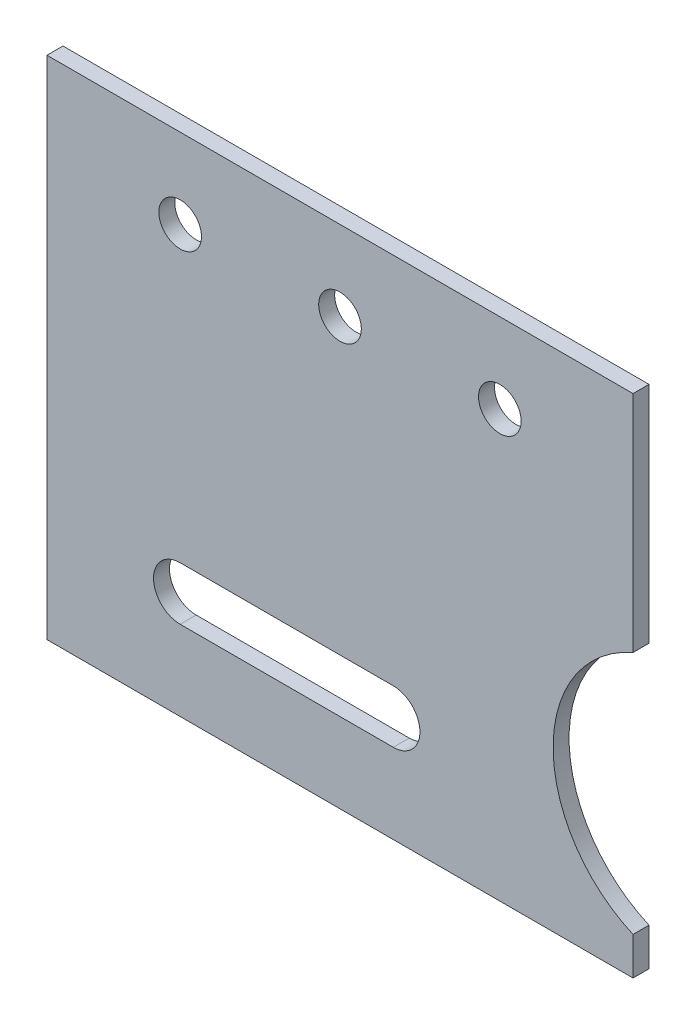
ISO-10303-21;
HEADER;
FILE_DESCRIPTION(('STEP AP214'),'2;1');
FILE_NAME('part.step','',(''),(''),'','','');
FILE_SCHEMA(('AUTOMOTIVE_DESIGN { 1 0 10303 214 1 1 1 1 }'));
ENDSEC;
DATA;
#1=APPLICATION_CONTEXT('core data for automotive mechanical design processes');
#2=APPLICATION_PROTOCOL_DEFINITION('international standard','automotive_design',2000,#1);
#3=PRODUCT_CONTEXT('',#1,'mechanical');
#4=PRODUCT('Part','Part','',(#3));
#5=PRODUCT_RELATED_PRODUCT_CATEGORY('part','',(#4));
#6=PRODUCT_DEFINITION_FORMATION('','',#4);
#7=PRODUCT_DEFINITION_CONTEXT('part definition',#1,'design');
#8=PRODUCT_DEFINITION('design','',#6,#7);
#9=PRODUCT_DEFINITION_SHAPE('','',#8);
#10=(LENGTH_UNIT() NAMED_UNIT(*) SI_UNIT(.MILLI.,.METRE.));
#11=(NAMED_UNIT(*) PLANE_ANGLE_UNIT() SI_UNIT($,.RADIAN.));
#12=(NAMED_UNIT(*) SI_UNIT($,.STERADIAN.) SOLID_ANGLE_UNIT());
#13=UNCERTAINTY_MEASURE_WITH_UNIT(LENGTH_MEASURE(1.E-05),#10,'distance_accuracy_value','');
#14=(GEOMETRIC_REPRESENTATION_CONTEXT(3) GLOBAL_UNCERTAINTY_ASSIGNED_CONTEXT((#13)) GLOBAL_UNIT_ASSIGNED_CONTEXT((#10,
#11,#12)) REPRESENTATION_CONTEXT('',''));
#15=CARTESIAN_POINT('',(0.,0.,0.));
#16=DIRECTION('',(0.,0.,1.));
#17=DIRECTION('',(1.,0.,0.));
#18=AXIS2_PLACEMENT_3D('',#15,#16,#17);
#19=CARTESIAN_POINT('',(120.,30.,3.));
#20=DIRECTION('',(0.,0.,1.));
#21=DIRECTION('',(1.,0.,0.));
#22=AXIS2_PLACEMENT_3D('',#19,#20,#21);
#23=PLANE('',#22);
#24=CARTESIAN_POINT('',(55.,80.,3.));
#25=DIRECTION('',(0.,0.,1.));
#26=DIRECTION('',(1.,0.,0.));
#27=AXIS2_PLACEMENT_3D('',#24,#25,#26);
#28=CIRCLE('',#27,4.00000000000001);
#29=CARTESIAN_POINT('',(59.,80.,3.));
#30=VERTEX_POINT('',#29);
#31=EDGE_CURVE('E173',#30,#30,#28,.T.);
#32=ORIENTED_EDGE('',*,*,#31,.F.);
#33=EDGE_LOOP('',(#32));
#34=FACE_BOUND('',#33,.T.);
#35=DIRECTION('',(0.,-1.,0.));
#36=VECTOR('',#35,1.);
#37=CARTESIAN_POINT('',(0.,0.,3.));
#38=LINE('',#37,#36);
#39=CARTESIAN_POINT('',(0.,95.,3.));
#40=VERTEX_POINT('',#39);
#41=CARTESIAN_POINT('',(0.,0.,3.));
#42=VERTEX_POINT('',#41);
#43=EDGE_CURVE('E189',#40,#42,#38,.T.);
#44=ORIENTED_EDGE('',*,*,#43,.T.);
#45=DIRECTION('',(1.,0.,0.));
#46=VECTOR('',#45,1.);
#47=CARTESIAN_POINT('',(0.,0.,3.));
#48=LINE('',#47,#46);
#49=CARTESIAN_POINT('',(110.,0.,3.));
#50=VERTEX_POINT('',#49);
#51=EDGE_CURVE('E193',#42,#50,#48,.T.);
#52=ORIENTED_EDGE('',*,*,#51,.T.);
#53=DIRECTION('',(0.,1.,0.));
#54=VECTOR('',#53,1.);
#55=CARTESIAN_POINT('',(110.,0.,3.));
#56=LINE('',#55,#54);
#57=CARTESIAN_POINT('',(110.,7.08712152522079,3.));
#58=VERTEX_POINT('',#57);
#59=EDGE_CURVE('E197',#50,#58,#56,.T.);
#60=ORIENTED_EDGE('',*,*,#59,.T.);
#61=CARTESIAN_POINT('',(120.,30.,3.));
#62=DIRECTION('',(0.,0.,-1.));
#63=DIRECTION('',(1.,0.,0.));
#64=AXIS2_PLACEMENT_3D('',#61,#62,#63);
#65=CIRCLE('',#64,25.);
#66=CARTESIAN_POINT('',(110.,52.9128784747792,3.));
#67=VERTEX_POINT('',#66);
#68=EDGE_CURVE('E200',#58,#67,#65,.T.);
#69=ORIENTED_EDGE('',*,*,#68,.T.);
#70=DIRECTION('',(0.,1.,0.));
#71=VECTOR('',#70,1.);
#72=CARTESIAN_POINT('',(110.,52.9128784747792,3.));
#73=LINE('',#72,#71);
#74=CARTESIAN_POINT('',(110.,95.,3.));
#75=VERTEX_POINT('',#74);
#76=EDGE_CURVE('E203',#67,#75,#73,.T.);
#77=ORIENTED_EDGE('',*,*,#76,.T.);
#78=DIRECTION('',(-1.,0.,0.));
#79=VECTOR('',#78,1.);
#80=CARTESIAN_POINT('',(0.,95.,3.));
#81=LINE('',#80,#79);
#82=EDGE_CURVE('E206',#75,#40,#81,.T.);
#83=ORIENTED_EDGE('',*,*,#82,.T.);
#84=EDGE_LOOP('',(#44,#52,#60,#69,#77,#83));
#85=FACE_BOUND('',#84,.T.);
#86=CARTESIAN_POINT('',(25.,80.,3.));
#87=DIRECTION('',(0.,0.,1.));
#88=DIRECTION('',(1.,0.,0.));
#89=AXIS2_PLACEMENT_3D('',#86,#87,#88);
#90=CIRCLE('',#89,4.);
#91=CARTESIAN_POINT('',(29.,80.,3.));
#92=VERTEX_POINT('',#91);
#93=EDGE_CURVE('E181',#92,#92,#90,.T.);
#94=ORIENTED_EDGE('',*,*,#93,.F.);
#95=EDGE_LOOP('',(#94));
#96=FACE_BOUND('',#95,.T.);
#97=CARTESIAN_POINT('',(85.,80.,3.));
#98=DIRECTION('',(0.,0.,1.));
#99=DIRECTION('',(1.,0.,0.));
#100=AXIS2_PLACEMENT_3D('',#97,#98,#99);
#101=CIRCLE('',#100,4.00000000000001);
#102=CARTESIAN_POINT('',(89.,80.,3.));
#103=VERTEX_POINT('',#102);
#104=EDGE_CURVE('E165',#103,#103,#101,.T.);
#105=ORIENTED_EDGE('',*,*,#104,.F.);
#106=EDGE_LOOP('',(#105));
#107=FACE_BOUND('',#106,.T.);
#108=DIRECTION('',(1.,0.,0.));
#109=VECTOR('',#108,1.);
#110=CARTESIAN_POINT('',(25.,15.,3.));
#111=LINE('',#110,#109);
#112=CARTESIAN_POINT('',(25.,15.,3.));
#113=VERTEX_POINT('',#112);
#114=CARTESIAN_POINT('',(65.,15.,3.));
#115=VERTEX_POINT('',#114);
#116=EDGE_CURVE('E126',#113,#115,#111,.T.);
#117=ORIENTED_EDGE('',*,*,#116,.F.);
#118=CARTESIAN_POINT('',(25.,20.,3.));
#119=DIRECTION('',(0.,0.,1.));
#120=DIRECTION('',(1.,0.,0.));
#121=AXIS2_PLACEMENT_3D('',#118,#119,#120);
#122=CIRCLE('',#121,5.);
#123=CARTESIAN_POINT('',(25.,25.,3.));
#124=VERTEX_POINT('',#123);
#125=EDGE_CURVE('E117',#124,#113,#122,.T.);
#126=ORIENTED_EDGE('',*,*,#125,.F.);
#127=DIRECTION('',(-1.,0.,0.));
#128=VECTOR('',#127,1.);
#129=CARTESIAN_POINT('',(25.,25.,3.));
#130=LINE('',#129,#128);
#131=CARTESIAN_POINT('',(65.,25.,3.));
#132=VERTEX_POINT('',#131);
#133=EDGE_CURVE('E143',#132,#124,#130,.T.);
#134=ORIENTED_EDGE('',*,*,#133,.F.);
#135=CARTESIAN_POINT('',(65.,20.,3.));
#136=DIRECTION('',(0.,0.,1.));
#137=DIRECTION('',(1.,0.,0.));
#138=AXIS2_PLACEMENT_3D('',#135,#136,#137);
#139=CIRCLE('',#138,5.);
#140=EDGE_CURVE('E139',#115,#132,#139,.T.);
#141=ORIENTED_EDGE('',*,*,#140,.F.);
#142=EDGE_LOOP('',(#117,#126,#134,#141));
#143=FACE_BOUND('',#142,.T.);
#144=ADVANCED_FACE('F39',(#34,#85,#96,#107,#143),#23,.T.);
#145=CARTESIAN_POINT('',(120.,30.,0.));
#146=DIRECTION('',(0.,0.,1.));
#147=DIRECTION('',(1.,0.,0.));
#148=AXIS2_PLACEMENT_3D('',#145,#146,#147);
#149=PLANE('',#148);
#150=CARTESIAN_POINT('',(85.,80.,0.));
#151=DIRECTION('',(0.,0.,1.));
#152=DIRECTION('',(1.,0.,0.));
#153=AXIS2_PLACEMENT_3D('',#150,#151,#152);
#154=CIRCLE('',#153,4.00000000000001);
#155=CARTESIAN_POINT('',(89.,80.,0.));
#156=VERTEX_POINT('',#155);
#157=EDGE_CURVE('E135',#156,#156,#154,.T.);
#158=ORIENTED_EDGE('',*,*,#157,.T.);
#159=EDGE_LOOP('',(#158));
#160=FACE_BOUND('',#159,.T.);
#161=CARTESIAN_POINT('',(55.,80.,0.));
#162=DIRECTION('',(0.,0.,1.));
#163=DIRECTION('',(1.,0.,0.));
#164=AXIS2_PLACEMENT_3D('',#161,#162,#163);
#165=CIRCLE('',#164,4.00000000000001);
#166=CARTESIAN_POINT('',(59.,80.,0.));
#167=VERTEX_POINT('',#166);
#168=EDGE_CURVE('E169',#167,#167,#165,.T.);
#169=ORIENTED_EDGE('',*,*,#168,.T.);
#170=EDGE_LOOP('',(#169));
#171=FACE_BOUND('',#170,.T.);
#172=CARTESIAN_POINT('',(25.,80.,0.));
#173=DIRECTION('',(0.,0.,1.));
#174=DIRECTION('',(1.,0.,0.));
#175=AXIS2_PLACEMENT_3D('',#172,#173,#174);
#176=CIRCLE('',#175,4.);
#177=CARTESIAN_POINT('',(29.,80.,0.));
#178=VERTEX_POINT('',#177);
#179=EDGE_CURVE('E177',#178,#178,#176,.T.);
#180=ORIENTED_EDGE('',*,*,#179,.T.);
#181=EDGE_LOOP('',(#180));
#182=FACE_BOUND('',#181,.T.);
#183=DIRECTION('',(0.,-1.,0.));
#184=VECTOR('',#183,1.);
#185=CARTESIAN_POINT('',(0.,0.,0.));
#186=LINE('',#185,#184);
#187=CARTESIAN_POINT('',(0.,95.,0.));
#188=VERTEX_POINT('',#187);
#189=CARTESIAN_POINT('',(0.,0.,0.));
#190=VERTEX_POINT('',#189);
#191=EDGE_CURVE('E185',#188,#190,#186,.T.);
#192=ORIENTED_EDGE('',*,*,#191,.F.);
#193=DIRECTION('',(-1.,0.,0.));
#194=VECTOR('',#193,1.);
#195=CARTESIAN_POINT('',(0.,95.,0.));
#196=LINE('',#195,#194);
#197=CARTESIAN_POINT('',(110.,95.,0.));
#198=VERTEX_POINT('',#197);
#199=EDGE_CURVE('E194',#198,#188,#196,.T.);
#200=ORIENTED_EDGE('',*,*,#199,.F.);
#201=DIRECTION('',(0.,1.,0.));
#202=VECTOR('',#201,1.);
#203=CARTESIAN_POINT('',(110.,52.9128784747792,0.));
#204=LINE('',#203,#202);
#205=CARTESIAN_POINT('',(110.,52.9128784747792,0.));
#206=VERTEX_POINT('',#205);
#207=EDGE_CURVE('E222',#206,#198,#204,.T.);
#208=ORIENTED_EDGE('',*,*,#207,.F.);
#209=CARTESIAN_POINT('',(120.,30.,0.));
#210=DIRECTION('',(0.,0.,-1.));
#211=DIRECTION('',(1.,0.,0.));
#212=AXIS2_PLACEMENT_3D('',#209,#210,#211);
#213=CIRCLE('',#212,25.);
#214=CARTESIAN_POINT('',(110.,7.08712152522079,0.));
#215=VERTEX_POINT('',#214);
#216=EDGE_CURVE('E219',#215,#206,#213,.T.);
#217=ORIENTED_EDGE('',*,*,#216,.F.);
#218=DIRECTION('',(0.,1.,0.));
#219=VECTOR('',#218,1.);
#220=CARTESIAN_POINT('',(110.,0.,0.));
#221=LINE('',#220,#219);
#222=CARTESIAN_POINT('',(110.,0.,0.));
#223=VERTEX_POINT('',#222);
#224=EDGE_CURVE('E216',#223,#215,#221,.T.);
#225=ORIENTED_EDGE('',*,*,#224,.F.);
#226=DIRECTION('',(1.,0.,0.));
#227=VECTOR('',#226,1.);
#228=CARTESIAN_POINT('',(0.,0.,0.));
#229=LINE('',#228,#227);
#230=EDGE_CURVE('E213',#190,#223,#229,.T.);
#231=ORIENTED_EDGE('',*,*,#230,.F.);
#232=EDGE_LOOP('',(#192,#200,#208,#217,#225,#231));
#233=FACE_BOUND('',#232,.T.);
#234=CARTESIAN_POINT('',(25.,20.,0.));
#235=DIRECTION('',(0.,0.,1.));
#236=DIRECTION('',(1.,0.,0.));
#237=AXIS2_PLACEMENT_3D('',#234,#235,#236);
#238=CIRCLE('',#237,5.);
#239=CARTESIAN_POINT('',(25.,25.,0.));
#240=VERTEX_POINT('',#239);
#241=CARTESIAN_POINT('',(25.,15.,0.));
#242=VERTEX_POINT('',#241);
#243=EDGE_CURVE('E63',#240,#242,#238,.T.);
#244=ORIENTED_EDGE('',*,*,#243,.T.);
#245=DIRECTION('',(1.,0.,0.));
#246=VECTOR('',#245,1.);
#247=CARTESIAN_POINT('',(25.,15.,0.));
#248=LINE('',#247,#246);
#249=CARTESIAN_POINT('',(65.,15.,0.));
#250=VERTEX_POINT('',#249);
#251=EDGE_CURVE('E133',#242,#250,#248,.T.);
#252=ORIENTED_EDGE('',*,*,#251,.T.);
#253=CARTESIAN_POINT('',(65.,20.,0.));
#254=DIRECTION('',(0.,0.,1.));
#255=DIRECTION('',(1.,0.,0.));
#256=AXIS2_PLACEMENT_3D('',#253,#254,#255);
#257=CIRCLE('',#256,5.);
#258=CARTESIAN_POINT('',(65.,25.,0.));
#259=VERTEX_POINT('',#258);
#260=EDGE_CURVE('E152',#250,#259,#257,.T.);
#261=ORIENTED_EDGE('',*,*,#260,.T.);
#262=DIRECTION('',(-1.,0.,0.));
#263=VECTOR('',#262,1.);
#264=CARTESIAN_POINT('',(25.,25.,0.));
#265=LINE('',#264,#263);
#266=EDGE_CURVE('E127',#259,#240,#265,.T.);
#267=ORIENTED_EDGE('',*,*,#266,.T.);
#268=EDGE_LOOP('',(#244,#252,#261,#267));
#269=FACE_BOUND('',#268,.T.);
#270=ADVANCED_FACE('F253',(#160,#171,#182,#233,#269),#149,.F.);
#271=CARTESIAN_POINT('',(0.,0.,3.));
#272=DIRECTION('',(1.,0.,0.));
#273=DIRECTION('',(0.,0.,-1.));
#274=AXIS2_PLACEMENT_3D('',#271,#272,#273);
#275=PLANE('',#274);
#276=ORIENTED_EDGE('',*,*,#191,.T.);
#277=DIRECTION('',(0.,0.,-1.));
#278=VECTOR('',#277,1.);
#279=CARTESIAN_POINT('',(0.,0.,3.));
#280=LINE('',#279,#278);
#281=EDGE_CURVE('E11',#42,#190,#280,.T.);
#282=ORIENTED_EDGE('',*,*,#281,.F.);
#283=ORIENTED_EDGE('',*,*,#43,.F.);
#284=DIRECTION('',(0.,0.,-1.));
#285=VECTOR('',#284,1.);
#286=CARTESIAN_POINT('',(0.,95.,3.));
#287=LINE('',#286,#285);
#288=EDGE_CURVE('E209',#40,#188,#287,.T.);
#289=ORIENTED_EDGE('',*,*,#288,.T.);
#290=EDGE_LOOP('',(#276,#282,#283,#289));
#291=FACE_BOUND('',#290,.T.);
#292=ADVANCED_FACE('F41',(#291),#275,.F.);
#293=CARTESIAN_POINT('',(0.,0.,3.));
#294=DIRECTION('',(0.,1.,0.));
#295=DIRECTION('',(0.,0.,1.));
#296=AXIS2_PLACEMENT_3D('',#293,#294,#295);
#297=PLANE('',#296);
#298=ORIENTED_EDGE('',*,*,#230,.T.);
#299=DIRECTION('',(0.,0.,-1.));
#300=VECTOR('',#299,1.);
#301=CARTESIAN_POINT('',(110.,0.,3.));
#302=LINE('',#301,#300);
#303=EDGE_CURVE('E48',#50,#223,#302,.T.);
#304=ORIENTED_EDGE('',*,*,#303,.F.);
#305=ORIENTED_EDGE('',*,*,#51,.F.);
#306=ORIENTED_EDGE('',*,*,#281,.T.);
#307=EDGE_LOOP('',(#298,#304,#305,#306));
#308=FACE_BOUND('',#307,.T.);
#309=ADVANCED_FACE('F271',(#308),#297,.F.);
#310=CARTESIAN_POINT('',(110.,0.,3.));
#311=DIRECTION('',(-1.,0.,0.));
#312=DIRECTION('',(0.,0.,1.));
#313=AXIS2_PLACEMENT_3D('',#310,#311,#312);
#314=PLANE('',#313);
#315=ORIENTED_EDGE('',*,*,#224,.T.);
#316=DIRECTION('',(0.,0.,-1.));
#317=VECTOR('',#316,1.);
#318=CARTESIAN_POINT('',(110.,7.08712152522079,3.));
#319=LINE('',#318,#317);
#320=EDGE_CURVE('E238',#58,#215,#319,.T.);
#321=ORIENTED_EDGE('',*,*,#320,.F.);
#322=ORIENTED_EDGE('',*,*,#59,.F.);
#323=ORIENTED_EDGE('',*,*,#303,.T.);
#324=EDGE_LOOP('',(#315,#321,#322,#323));
#325=FACE_BOUND('',#324,.T.);
#326=ADVANCED_FACE('F247',(#325),#314,.F.);
#327=CARTESIAN_POINT('',(120.,30.,3.));
#328=DIRECTION('',(0.,0.,-1.));
#329=DIRECTION('',(-1.,0.,0.));
#330=AXIS2_PLACEMENT_3D('',#327,#328,#329);
#331=CYLINDRICAL_SURFACE('',#330,25.);
#332=ORIENTED_EDGE('',*,*,#216,.T.);
#333=DIRECTION('',(0.,0.,-1.));
#334=VECTOR('',#333,1.);
#335=CARTESIAN_POINT('',(110.,52.9128784747792,3.));
#336=LINE('',#335,#334);
#337=EDGE_CURVE('E234',#67,#206,#336,.T.);
#338=ORIENTED_EDGE('',*,*,#337,.F.);
#339=ORIENTED_EDGE('',*,*,#68,.F.);
#340=ORIENTED_EDGE('',*,*,#320,.T.);
#341=EDGE_LOOP('',(#332,#338,#339,#340));
#342=FACE_BOUND('',#341,.T.);
#343=ADVANCED_FACE('F259',(#342),#331,.F.);
#344=CARTESIAN_POINT('',(110.,52.9128784747792,3.));
#345=DIRECTION('',(-1.,0.,0.));
#346=DIRECTION('',(0.,0.,1.));
#347=AXIS2_PLACEMENT_3D('',#344,#345,#346);
#348=PLANE('',#347);
#349=ORIENTED_EDGE('',*,*,#207,.T.);
#350=DIRECTION('',(0.,0.,-1.));
#351=VECTOR('',#350,1.);
#352=CARTESIAN_POINT('',(110.,95.,3.));
#353=LINE('',#352,#351);
#354=EDGE_CURVE('E230',#75,#198,#353,.T.);
#355=ORIENTED_EDGE('',*,*,#354,.F.);
#356=ORIENTED_EDGE('',*,*,#76,.F.);
#357=ORIENTED_EDGE('',*,*,#337,.T.);
#358=EDGE_LOOP('',(#349,#355,#356,#357));
#359=FACE_BOUND('',#358,.T.);
#360=ADVANCED_FACE('F263',(#359),#348,.F.);
#361=CARTESIAN_POINT('',(0.,95.,3.));
#362=DIRECTION('',(0.,-1.,0.));
#363=DIRECTION('',(0.,0.,-1.));
#364=AXIS2_PLACEMENT_3D('',#361,#362,#363);
#365=PLANE('',#364);
#366=ORIENTED_EDGE('',*,*,#199,.T.);
#367=ORIENTED_EDGE('',*,*,#288,.F.);
#368=ORIENTED_EDGE('',*,*,#82,.F.);
#369=ORIENTED_EDGE('',*,*,#354,.T.);
#370=EDGE_LOOP('',(#366,#367,#368,#369));
#371=FACE_BOUND('',#370,.T.);
#372=ADVANCED_FACE('F274',(#371),#365,.F.);
#373=CARTESIAN_POINT('',(25.,80.,3.));
#374=DIRECTION('',(0.,0.,-1.));
#375=DIRECTION('',(-1.,0.,0.));
#376=AXIS2_PLACEMENT_3D('',#373,#374,#375);
#377=CYLINDRICAL_SURFACE('',#376,4.);
#378=ORIENTED_EDGE('',*,*,#93,.T.);
#379=EDGE_LOOP('',(#378));
#380=FACE_BOUND('',#379,.T.);
#381=ORIENTED_EDGE('',*,*,#179,.F.);
#382=EDGE_LOOP('',(#381));
#383=FACE_BOUND('',#382,.T.);
#384=ADVANCED_FACE('F276',(#380,#383),#377,.F.);
#385=CARTESIAN_POINT('',(55.,80.,3.));
#386=DIRECTION('',(0.,0.,-1.));
#387=DIRECTION('',(-1.,0.,0.));
#388=AXIS2_PLACEMENT_3D('',#385,#386,#387);
#389=CYLINDRICAL_SURFACE('',#388,4.00000000000001);
#390=ORIENTED_EDGE('',*,*,#31,.T.);
#391=EDGE_LOOP('',(#390));
#392=FACE_BOUND('',#391,.T.);
#393=ORIENTED_EDGE('',*,*,#168,.F.);
#394=EDGE_LOOP('',(#393));
#395=FACE_BOUND('',#394,.T.);
#396=ADVANCED_FACE('F282',(#392,#395),#389,.F.);
#397=CARTESIAN_POINT('',(85.,80.,3.));
#398=DIRECTION('',(0.,0.,-1.));
#399=DIRECTION('',(-1.,0.,0.));
#400=AXIS2_PLACEMENT_3D('',#397,#398,#399);
#401=CYLINDRICAL_SURFACE('',#400,4.00000000000001);
#402=ORIENTED_EDGE('',*,*,#104,.T.);
#403=EDGE_LOOP('',(#402));
#404=FACE_BOUND('',#403,.T.);
#405=ORIENTED_EDGE('',*,*,#157,.F.);
#406=EDGE_LOOP('',(#405));
#407=FACE_BOUND('',#406,.T.);
#408=ADVANCED_FACE('F298',(#404,#407),#401,.F.);
#409=CARTESIAN_POINT('',(25.,20.,3.));
#410=DIRECTION('',(0.,0.,-1.));
#411=DIRECTION('',(-1.,0.,0.));
#412=AXIS2_PLACEMENT_3D('',#409,#410,#411);
#413=CYLINDRICAL_SURFACE('',#412,5.);
#414=ORIENTED_EDGE('',*,*,#243,.F.);
#415=DIRECTION('',(0.,0.,-1.));
#416=VECTOR('',#415,1.);
#417=CARTESIAN_POINT('',(25.,25.,3.));
#418=LINE('',#417,#416);
#419=EDGE_CURVE('E121',#124,#240,#418,.T.);
#420=ORIENTED_EDGE('',*,*,#419,.F.);
#421=ORIENTED_EDGE('',*,*,#125,.T.);
#422=DIRECTION('',(0.,0.,-1.));
#423=VECTOR('',#422,1.);
#424=CARTESIAN_POINT('',(25.,15.,3.));
#425=LINE('',#424,#423);
#426=EDGE_CURVE('E120',#113,#242,#425,.T.);
#427=ORIENTED_EDGE('',*,*,#426,.T.);
#428=EDGE_LOOP('',(#414,#420,#421,#427));
#429=FACE_BOUND('',#428,.T.);
#430=ADVANCED_FACE('F119',(#429),#413,.F.);
#431=CARTESIAN_POINT('',(25.,15.,3.));
#432=DIRECTION('',(0.,1.,0.));
#433=DIRECTION('',(-1.,0.,0.));
#434=AXIS2_PLACEMENT_3D('',#431,#432,#433);
#435=PLANE('',#434);
#436=ORIENTED_EDGE('',*,*,#251,.F.);
#437=ORIENTED_EDGE('',*,*,#426,.F.);
#438=ORIENTED_EDGE('',*,*,#116,.T.);
#439=DIRECTION('',(0.,0.,-1.));
#440=VECTOR('',#439,1.);
#441=CARTESIAN_POINT('',(65.,15.,3.));
#442=LINE('',#441,#440);
#443=EDGE_CURVE('E136',#115,#250,#442,.T.);
#444=ORIENTED_EDGE('',*,*,#443,.T.);
#445=EDGE_LOOP('',(#436,#437,#438,#444));
#446=FACE_BOUND('',#445,.T.);
#447=ADVANCED_FACE('F130',(#446),#435,.T.);
#448=CARTESIAN_POINT('',(65.,20.,3.));
#449=DIRECTION('',(0.,0.,-1.));
#450=DIRECTION('',(-1.,0.,0.));
#451=AXIS2_PLACEMENT_3D('',#448,#449,#450);
#452=CYLINDRICAL_SURFACE('',#451,5.);
#453=ORIENTED_EDGE('',*,*,#260,.F.);
#454=ORIENTED_EDGE('',*,*,#443,.F.);
#455=ORIENTED_EDGE('',*,*,#140,.T.);
#456=DIRECTION('',(0.,0.,-1.));
#457=VECTOR('',#456,1.);
#458=CARTESIAN_POINT('',(65.,25.,3.));
#459=LINE('',#458,#457);
#460=EDGE_CURVE('E55',#132,#259,#459,.T.);
#461=ORIENTED_EDGE('',*,*,#460,.T.);
#462=EDGE_LOOP('',(#453,#454,#455,#461));
#463=FACE_BOUND('',#462,.T.);
#464=ADVANCED_FACE('F307',(#463),#452,.F.);
#465=CARTESIAN_POINT('',(25.,25.,3.));
#466=DIRECTION('',(0.,-1.,0.));
#467=DIRECTION('',(1.,0.,0.));
#468=AXIS2_PLACEMENT_3D('',#465,#466,#467);
#469=PLANE('',#468);
#470=ORIENTED_EDGE('',*,*,#266,.F.);
#471=ORIENTED_EDGE('',*,*,#460,.F.);
#472=ORIENTED_EDGE('',*,*,#133,.T.);
#473=ORIENTED_EDGE('',*,*,#419,.T.);
#474=EDGE_LOOP('',(#470,#471,#472,#473));
#475=FACE_BOUND('',#474,.T.);
#476=ADVANCED_FACE('F310',(#475),#469,.T.);
#477=CLOSED_SHELL('',(#144,#270,#292,#309,#326,#343,#360,#372,#384,#396,#408,#430,#447,#464,#476));
#478=MANIFOLD_SOLID_BREP('B2',#477);
#479=ADVANCED_BREP_SHAPE_REPRESENTATION('',(#18,#478),#14);
#480=SHAPE_DEFINITION_REPRESENTATION(#9,#479);
ENDSEC;
END-ISO-10303-21;
